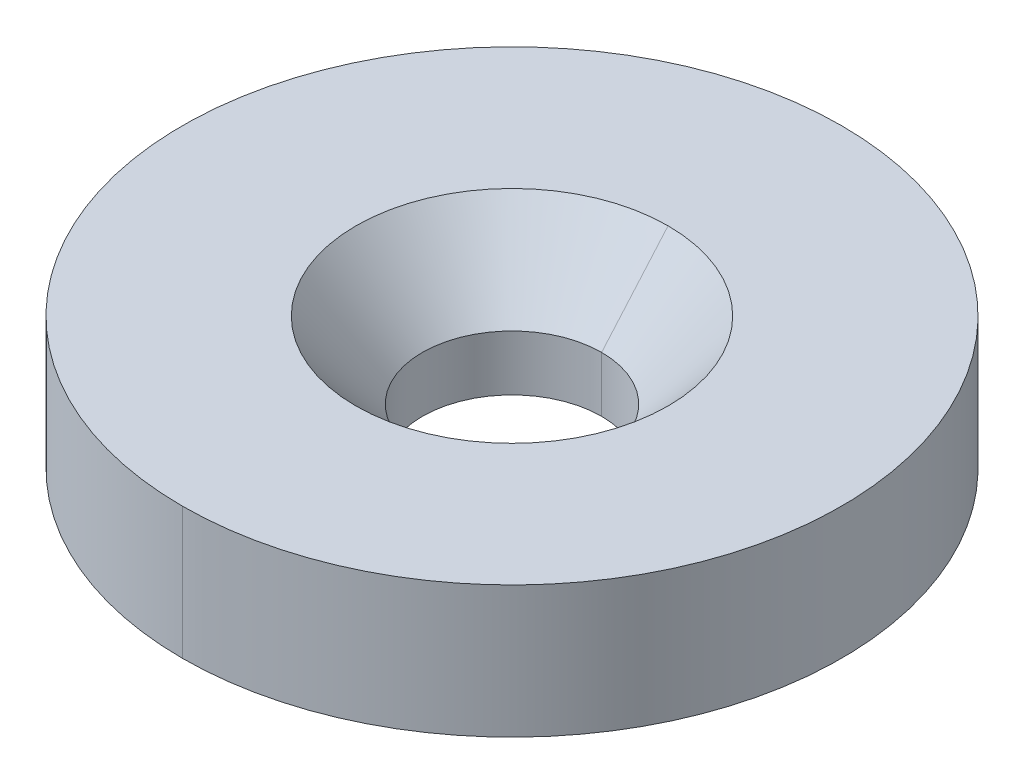
ISO-10303-21;
HEADER;
FILE_DESCRIPTION(('STEP AP214'),'2;1');
FILE_NAME('part.step','',(''),(''),'','','');
FILE_SCHEMA(('AUTOMOTIVE_DESIGN { 1 0 10303 214 1 1 1 1 }'));
ENDSEC;
DATA;
#1=APPLICATION_CONTEXT('core data for automotive mechanical design processes');
#2=APPLICATION_PROTOCOL_DEFINITION('international standard','automotive_design',2000,#1);
#3=PRODUCT_CONTEXT('',#1,'mechanical');
#4=PRODUCT('Part','Part','',(#3));
#5=PRODUCT_RELATED_PRODUCT_CATEGORY('part','',(#4));
#6=PRODUCT_DEFINITION_FORMATION('','',#4);
#7=PRODUCT_DEFINITION_CONTEXT('part definition',#1,'design');
#8=PRODUCT_DEFINITION('design','',#6,#7);
#9=PRODUCT_DEFINITION_SHAPE('','',#8);
#10=(LENGTH_UNIT() NAMED_UNIT(*) SI_UNIT(.MILLI.,.METRE.));
#11=(NAMED_UNIT(*) PLANE_ANGLE_UNIT() SI_UNIT($,.RADIAN.));
#12=(NAMED_UNIT(*) SI_UNIT($,.STERADIAN.) SOLID_ANGLE_UNIT());
#13=UNCERTAINTY_MEASURE_WITH_UNIT(LENGTH_MEASURE(1.E-05),#10,'distance_accuracy_value','');
#14=(GEOMETRIC_REPRESENTATION_CONTEXT(3) GLOBAL_UNCERTAINTY_ASSIGNED_CONTEXT((#13)) GLOBAL_UNIT_ASSIGNED_CONTEXT((#10,
#11,#12)) REPRESENTATION_CONTEXT('',''));
#15=CARTESIAN_POINT('',(0.,0.,0.));
#16=DIRECTION('',(0.,0.,1.));
#17=DIRECTION('',(1.,0.,0.));
#18=AXIS2_PLACEMENT_3D('',#15,#16,#17);
#19=CARTESIAN_POINT('',(0.,0.,0.));
#20=DIRECTION('',(0.,-1.,0.));
#21=DIRECTION('',(0.,0.,-1.));
#22=AXIS2_PLACEMENT_3D('',#19,#20,#21);
#23=CYLINDRICAL_SURFACE('',#22,2.159);
#24=CARTESIAN_POINT('',(0.,-0.253319525235081,0.));
#25=DIRECTION('',(0.,-1.,0.));
#26=DIRECTION('',(0.,0.,-1.));
#27=AXIS2_PLACEMENT_3D('',#24,#25,#26);
#28=CIRCLE('',#27,2.159);
#29=CARTESIAN_POINT('',(0.,-0.253319525235081,2.159));
#30=VERTEX_POINT('',#29);
#31=CARTESIAN_POINT('',(0.,-0.253319525235081,-2.159));
#32=VERTEX_POINT('',#31);
#33=EDGE_CURVE('E120',#30,#32,#28,.T.);
#34=ORIENTED_EDGE('',*,*,#33,.F.);
#35=DIRECTION('',(0.,-1.,0.));
#36=VECTOR('',#35,1.);
#37=CARTESIAN_POINT('',(0.,0.,2.159));
#38=LINE('',#37,#36);
#39=CARTESIAN_POINT('',(0.,-1.5875,2.159));
#40=VERTEX_POINT('',#39);
#41=EDGE_CURVE('E11',#30,#40,#38,.T.);
#42=ORIENTED_EDGE('',*,*,#41,.T.);
#43=CARTESIAN_POINT('',(0.,-1.5875,0.));
#44=DIRECTION('',(0.,-1.,0.));
#45=DIRECTION('',(0.,0.,-1.));
#46=AXIS2_PLACEMENT_3D('',#43,#44,#45);
#47=CIRCLE('',#46,2.159);
#48=CARTESIAN_POINT('',(0.,-1.5875,-2.159));
#49=VERTEX_POINT('',#48);
#50=EDGE_CURVE('E26',#40,#49,#47,.T.);
#51=ORIENTED_EDGE('',*,*,#50,.T.);
#52=DIRECTION('',(0.,-1.,0.));
#53=VECTOR('',#52,1.);
#54=CARTESIAN_POINT('',(0.,0.,-2.159));
#55=LINE('',#54,#53);
#56=EDGE_CURVE('E125',#32,#49,#55,.T.);
#57=ORIENTED_EDGE('',*,*,#56,.F.);
#58=EDGE_LOOP('',(#34,#42,#51,#57));
#59=FACE_BOUND('',#58,.T.);
#60=ADVANCED_FACE('F16',(#59),#23,.F.);
#61=CARTESIAN_POINT('',(0.,-0.253319525235081,0.));
#62=DIRECTION('',(0.,1.,0.));
#63=DIRECTION('',(0.,0.,1.));
#64=AXIS2_PLACEMENT_3D('',#61,#62,#63);
#65=CONICAL_SURFACE('',#64,2.159,0.715584993317669);
#66=ORIENTED_EDGE('',*,*,#33,.T.);
#67=DIRECTION('',(0.,0.754709580222776,-0.656059028990503));
#68=VECTOR('',#67,1.);
#69=CARTESIAN_POINT('',(0.,-0.253319525235081,-2.159));
#70=LINE('',#69,#68);
#71=CARTESIAN_POINT('',(0.,1.5875,-3.7592));
#72=VERTEX_POINT('',#71);
#73=EDGE_CURVE('E106',#32,#72,#70,.T.);
#74=ORIENTED_EDGE('',*,*,#73,.T.);
#75=CARTESIAN_POINT('',(0.,1.5875,0.));
#76=DIRECTION('',(0.,-1.,0.));
#77=DIRECTION('',(0.,0.,-1.));
#78=AXIS2_PLACEMENT_3D('',#75,#76,#77);
#79=CIRCLE('',#78,3.7592);
#80=CARTESIAN_POINT('',(0.,1.5875,3.7592));
#81=VERTEX_POINT('',#80);
#82=EDGE_CURVE('E100',#81,#72,#79,.T.);
#83=ORIENTED_EDGE('',*,*,#82,.F.);
#84=DIRECTION('',(0.,0.754709580222776,0.656059028990503));
#85=VECTOR('',#84,1.);
#86=CARTESIAN_POINT('',(0.,-0.253319525235081,2.159));
#87=LINE('',#86,#85);
#88=EDGE_CURVE('E20',#30,#81,#87,.T.);
#89=ORIENTED_EDGE('',*,*,#88,.F.);
#90=EDGE_LOOP('',(#66,#74,#83,#89));
#91=FACE_BOUND('',#90,.T.);
#92=ADVANCED_FACE('F159',(#91),#65,.F.);
#93=CARTESIAN_POINT('',(0.,1.5875,0.));
#94=DIRECTION('',(0.,-1.,0.));
#95=DIRECTION('',(0.,0.,-1.));
#96=AXIS2_PLACEMENT_3D('',#93,#94,#95);
#97=CYLINDRICAL_SURFACE('',#96,7.9375);
#98=CARTESIAN_POINT('',(0.,1.5875,0.));
#99=DIRECTION('',(0.,1.,0.));
#100=DIRECTION('',(0.,0.,1.));
#101=AXIS2_PLACEMENT_3D('',#98,#99,#100);
#102=CIRCLE('',#101,7.9375);
#103=CARTESIAN_POINT('',(0.,1.5875,7.9375));
#104=VERTEX_POINT('',#103);
#105=CARTESIAN_POINT('',(0.,1.5875,-7.9375));
#106=VERTEX_POINT('',#105);
#107=EDGE_CURVE('E89',#104,#106,#102,.T.);
#108=ORIENTED_EDGE('',*,*,#107,.F.);
#109=DIRECTION('',(0.,-1.,0.));
#110=VECTOR('',#109,1.);
#111=CARTESIAN_POINT('',(0.,1.5875,7.9375));
#112=LINE('',#111,#110);
#113=CARTESIAN_POINT('',(0.,-1.5875,7.9375));
#114=VERTEX_POINT('',#113);
#115=EDGE_CURVE('E97',#104,#114,#112,.T.);
#116=ORIENTED_EDGE('',*,*,#115,.T.);
#117=CARTESIAN_POINT('',(0.,-1.5875,0.));
#118=DIRECTION('',(0.,1.,0.));
#119=DIRECTION('',(0.,0.,1.));
#120=AXIS2_PLACEMENT_3D('',#117,#118,#119);
#121=CIRCLE('',#120,7.9375);
#122=CARTESIAN_POINT('',(0.,-1.5875,-7.9375));
#123=VERTEX_POINT('',#122);
#124=EDGE_CURVE('E107',#114,#123,#121,.T.);
#125=ORIENTED_EDGE('',*,*,#124,.T.);
#126=DIRECTION('',(0.,-1.,0.));
#127=VECTOR('',#126,1.);
#128=CARTESIAN_POINT('',(0.,1.5875,-7.9375));
#129=LINE('',#128,#127);
#130=EDGE_CURVE('E75',#106,#123,#129,.T.);
#131=ORIENTED_EDGE('',*,*,#130,.F.);
#132=EDGE_LOOP('',(#108,#116,#125,#131));
#133=FACE_BOUND('',#132,.T.);
#134=ADVANCED_FACE('F96',(#133),#97,.T.);
#135=CARTESIAN_POINT('',(0.,1.5875,0.));
#136=DIRECTION('',(0.,-1.,0.));
#137=DIRECTION('',(0.,0.,-1.));
#138=AXIS2_PLACEMENT_3D('',#135,#136,#137);
#139=CYLINDRICAL_SURFACE('',#138,7.9375);
#140=ORIENTED_EDGE('',*,*,#115,.F.);
#141=CARTESIAN_POINT('',(0.,1.5875,0.));
#142=DIRECTION('',(0.,1.,0.));
#143=DIRECTION('',(0.,0.,1.));
#144=AXIS2_PLACEMENT_3D('',#141,#142,#143);
#145=CIRCLE('',#144,7.9375);
#146=EDGE_CURVE('E99',#106,#104,#145,.T.);
#147=ORIENTED_EDGE('',*,*,#146,.F.);
#148=ORIENTED_EDGE('',*,*,#130,.T.);
#149=CARTESIAN_POINT('',(0.,-1.5875,0.));
#150=DIRECTION('',(0.,1.,0.));
#151=DIRECTION('',(0.,0.,1.));
#152=AXIS2_PLACEMENT_3D('',#149,#150,#151);
#153=CIRCLE('',#152,7.9375);
#154=EDGE_CURVE('E104',#123,#114,#153,.T.);
#155=ORIENTED_EDGE('',*,*,#154,.T.);
#156=EDGE_LOOP('',(#140,#147,#148,#155));
#157=FACE_BOUND('',#156,.T.);
#158=ADVANCED_FACE('F102',(#157),#139,.T.);
#159=CARTESIAN_POINT('',(0.,1.5875,0.));
#160=DIRECTION('',(0.,1.,0.));
#161=DIRECTION('',(1.,0.,0.));
#162=AXIS2_PLACEMENT_3D('',#159,#160,#161);
#163=PLANE('',#162);
#164=ORIENTED_EDGE('',*,*,#146,.T.);
#165=ORIENTED_EDGE('',*,*,#107,.T.);
#166=EDGE_LOOP('',(#164,#165));
#167=FACE_BOUND('',#166,.T.);
#168=ORIENTED_EDGE('',*,*,#82,.T.);
#169=CARTESIAN_POINT('',(0.,1.5875,0.));
#170=DIRECTION('',(0.,-1.,0.));
#171=DIRECTION('',(0.,0.,-1.));
#172=AXIS2_PLACEMENT_3D('',#169,#170,#171);
#173=CIRCLE('',#172,3.7592);
#174=EDGE_CURVE('E142',#72,#81,#173,.T.);
#175=ORIENTED_EDGE('',*,*,#174,.T.);
#176=EDGE_LOOP('',(#168,#175));
#177=FACE_BOUND('',#176,.T.);
#178=ADVANCED_FACE('F18',(#167,#177),#163,.T.);
#179=CARTESIAN_POINT('',(0.,-1.5875,0.));
#180=DIRECTION('',(0.,1.,0.));
#181=DIRECTION('',(1.,0.,0.));
#182=AXIS2_PLACEMENT_3D('',#179,#180,#181);
#183=PLANE('',#182);
#184=ORIENTED_EDGE('',*,*,#154,.F.);
#185=ORIENTED_EDGE('',*,*,#124,.F.);
#186=EDGE_LOOP('',(#184,#185));
#187=FACE_BOUND('',#186,.T.);
#188=CARTESIAN_POINT('',(0.,-1.5875,0.));
#189=DIRECTION('',(0.,-1.,0.));
#190=DIRECTION('',(0.,0.,-1.));
#191=AXIS2_PLACEMENT_3D('',#188,#189,#190);
#192=CIRCLE('',#191,2.159);
#193=EDGE_CURVE('E122',#49,#40,#192,.T.);
#194=ORIENTED_EDGE('',*,*,#193,.F.);
#195=ORIENTED_EDGE('',*,*,#50,.F.);
#196=EDGE_LOOP('',(#194,#195));
#197=FACE_BOUND('',#196,.T.);
#198=ADVANCED_FACE('F161',(#187,#197),#183,.F.);
#199=CARTESIAN_POINT('',(0.,-0.253319525235081,0.));
#200=DIRECTION('',(0.,1.,0.));
#201=DIRECTION('',(0.,0.,1.));
#202=AXIS2_PLACEMENT_3D('',#199,#200,#201);
#203=CONICAL_SURFACE('',#202,2.159,0.715584993317669);
#204=ORIENTED_EDGE('',*,*,#73,.F.);
#205=CARTESIAN_POINT('',(0.,-0.253319525235081,0.));
#206=DIRECTION('',(0.,-1.,0.));
#207=DIRECTION('',(0.,0.,-1.));
#208=AXIS2_PLACEMENT_3D('',#205,#206,#207);
#209=CIRCLE('',#208,2.159);
#210=EDGE_CURVE('E144',#32,#30,#209,.T.);
#211=ORIENTED_EDGE('',*,*,#210,.T.);
#212=ORIENTED_EDGE('',*,*,#88,.T.);
#213=ORIENTED_EDGE('',*,*,#174,.F.);
#214=EDGE_LOOP('',(#204,#211,#212,#213));
#215=FACE_BOUND('',#214,.T.);
#216=ADVANCED_FACE('F157',(#215),#203,.F.);
#217=CARTESIAN_POINT('',(0.,0.,0.));
#218=DIRECTION('',(0.,-1.,0.));
#219=DIRECTION('',(0.,0.,-1.));
#220=AXIS2_PLACEMENT_3D('',#217,#218,#219);
#221=CYLINDRICAL_SURFACE('',#220,2.159);
#222=ORIENTED_EDGE('',*,*,#41,.F.);
#223=ORIENTED_EDGE('',*,*,#210,.F.);
#224=ORIENTED_EDGE('',*,*,#56,.T.);
#225=ORIENTED_EDGE('',*,*,#193,.T.);
#226=EDGE_LOOP('',(#222,#223,#224,#225));
#227=FACE_BOUND('',#226,.T.);
#228=ADVANCED_FACE('F180',(#227),#221,.F.);
#229=CLOSED_SHELL('',(#60,#92,#134,#158,#178,#198,#216,#228));
#230=MANIFOLD_SOLID_BREP('B1',#229);
#231=ADVANCED_BREP_SHAPE_REPRESENTATION('',(#18,#230),#14);
#232=SHAPE_DEFINITION_REPRESENTATION(#9,#231);
ENDSEC;
END-ISO-10303-21;
